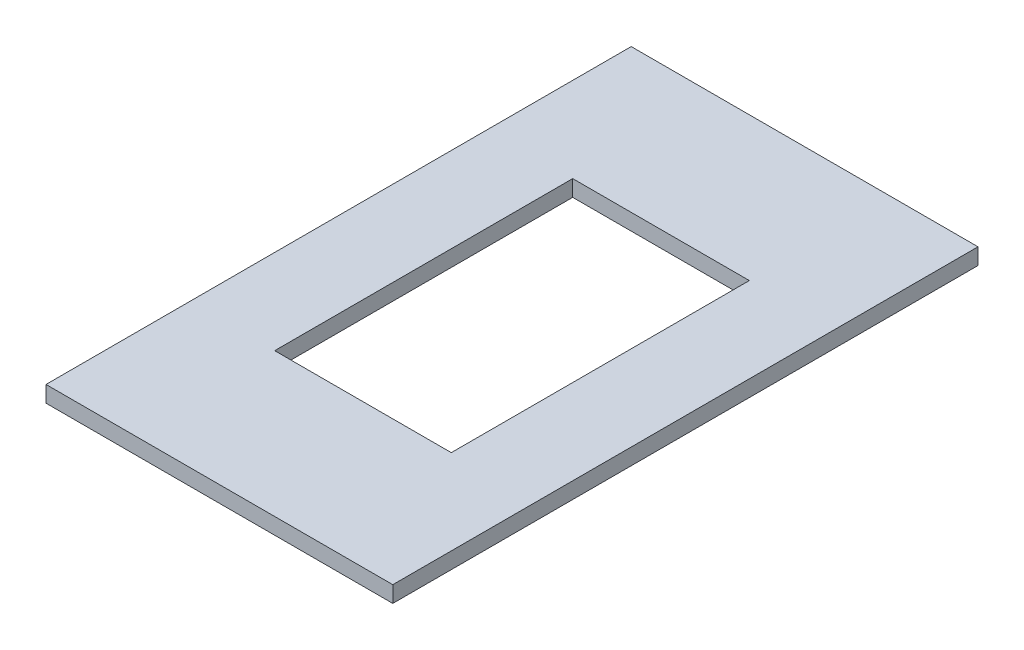
ISO-10303-21;
HEADER;
FILE_DESCRIPTION(('STEP AP214'),'2;1');
FILE_NAME('part.step','',(''),(''),'','','');
FILE_SCHEMA(('AUTOMOTIVE_DESIGN { 1 0 10303 214 1 1 1 1 }'));
ENDSEC;
DATA;
#1=APPLICATION_CONTEXT('core data for automotive mechanical design processes');
#2=APPLICATION_PROTOCOL_DEFINITION('international standard','automotive_design',2000,#1);
#3=PRODUCT_CONTEXT('',#1,'mechanical');
#4=PRODUCT('Part','Part','',(#3));
#5=PRODUCT_RELATED_PRODUCT_CATEGORY('part','',(#4));
#6=PRODUCT_DEFINITION_FORMATION('','',#4);
#7=PRODUCT_DEFINITION_CONTEXT('part definition',#1,'design');
#8=PRODUCT_DEFINITION('design','',#6,#7);
#9=PRODUCT_DEFINITION_SHAPE('','',#8);
#10=(LENGTH_UNIT() NAMED_UNIT(*) SI_UNIT(.MILLI.,.METRE.));
#11=(NAMED_UNIT(*) PLANE_ANGLE_UNIT() SI_UNIT($,.RADIAN.));
#12=(NAMED_UNIT(*) SI_UNIT($,.STERADIAN.) SOLID_ANGLE_UNIT());
#13=UNCERTAINTY_MEASURE_WITH_UNIT(LENGTH_MEASURE(1.E-05),#10,'distance_accuracy_value','');
#14=(GEOMETRIC_REPRESENTATION_CONTEXT(3) GLOBAL_UNCERTAINTY_ASSIGNED_CONTEXT((#13)) GLOBAL_UNIT_ASSIGNED_CONTEXT((#10,
#11,#12)) REPRESENTATION_CONTEXT('',''));
#15=CARTESIAN_POINT('',(0.,0.,0.));
#16=DIRECTION('',(0.,0.,1.));
#17=DIRECTION('',(1.,0.,0.));
#18=AXIS2_PLACEMENT_3D('',#15,#16,#17);
#19=CARTESIAN_POINT('',(213.3333333,10.,0.));
#20=DIRECTION('',(0.,0.,1.));
#21=DIRECTION('',(1.,0.,0.));
#22=AXIS2_PLACEMENT_3D('',#19,#20,#21);
#23=PLANE('',#22);
#24=DIRECTION('',(-1.,0.,0.));
#25=VECTOR('',#24,1.);
#26=CARTESIAN_POINT('',(213.3333333,0.,0.));
#27=LINE('',#26,#25);
#28=CARTESIAN_POINT('',(213.3333333,0.,0.));
#29=VERTEX_POINT('',#28);
#30=CARTESIAN_POINT('',(0.,0.,0.));
#31=VERTEX_POINT('',#30);
#32=EDGE_CURVE('E139',#29,#31,#27,.T.);
#33=ORIENTED_EDGE('',*,*,#32,.T.);
#34=DIRECTION('',(0.,-1.,0.));
#35=VECTOR('',#34,1.);
#36=CARTESIAN_POINT('',(0.,10.,0.));
#37=LINE('',#36,#35);
#38=CARTESIAN_POINT('',(0.,10.,0.));
#39=VERTEX_POINT('',#38);
#40=EDGE_CURVE('E11',#39,#31,#37,.T.);
#41=ORIENTED_EDGE('',*,*,#40,.F.);
#42=DIRECTION('',(-1.,0.,0.));
#43=VECTOR('',#42,1.);
#44=CARTESIAN_POINT('',(213.3333333,10.,0.));
#45=LINE('',#44,#43);
#46=CARTESIAN_POINT('',(213.3333333,10.,0.));
#47=VERTEX_POINT('',#46);
#48=EDGE_CURVE('E143',#47,#39,#45,.T.);
#49=ORIENTED_EDGE('',*,*,#48,.F.);
#50=DIRECTION('',(0.,-1.,0.));
#51=VECTOR('',#50,1.);
#52=CARTESIAN_POINT('',(213.3333333,10.,0.));
#53=LINE('',#52,#51);
#54=EDGE_CURVE('E153',#47,#29,#53,.T.);
#55=ORIENTED_EDGE('',*,*,#54,.T.);
#56=EDGE_LOOP('',(#33,#41,#49,#55));
#57=FACE_BOUND('',#56,.T.);
#58=ADVANCED_FACE('F42',(#57),#23,.F.);
#59=CARTESIAN_POINT('',(0.,10.,0.));
#60=DIRECTION('',(1.,0.,0.));
#61=DIRECTION('',(0.,0.,-1.));
#62=AXIS2_PLACEMENT_3D('',#59,#60,#61);
#63=PLANE('',#62);
#64=DIRECTION('',(0.,0.,1.));
#65=VECTOR('',#64,1.);
#66=CARTESIAN_POINT('',(0.,0.,0.));
#67=LINE('',#66,#65);
#68=CARTESIAN_POINT('',(0.,0.,360.));
#69=VERTEX_POINT('',#68);
#70=EDGE_CURVE('E156',#31,#69,#67,.T.);
#71=ORIENTED_EDGE('',*,*,#70,.T.);
#72=DIRECTION('',(0.,-1.,0.));
#73=VECTOR('',#72,1.);
#74=CARTESIAN_POINT('',(0.,10.,360.));
#75=LINE('',#74,#73);
#76=CARTESIAN_POINT('',(0.,10.,360.));
#77=VERTEX_POINT('',#76);
#78=EDGE_CURVE('E49',#77,#69,#75,.T.);
#79=ORIENTED_EDGE('',*,*,#78,.F.);
#80=DIRECTION('',(0.,0.,1.));
#81=VECTOR('',#80,1.);
#82=CARTESIAN_POINT('',(0.,10.,0.));
#83=LINE('',#82,#81);
#84=EDGE_CURVE('E146',#39,#77,#83,.T.);
#85=ORIENTED_EDGE('',*,*,#84,.F.);
#86=ORIENTED_EDGE('',*,*,#40,.T.);
#87=EDGE_LOOP('',(#71,#79,#85,#86));
#88=FACE_BOUND('',#87,.T.);
#89=ADVANCED_FACE('F184',(#88),#63,.F.);
#90=CARTESIAN_POINT('',(0.,10.,360.));
#91=DIRECTION('',(0.,0.,-1.));
#92=DIRECTION('',(-1.,0.,0.));
#93=AXIS2_PLACEMENT_3D('',#90,#91,#92);
#94=PLANE('',#93);
#95=DIRECTION('',(1.,0.,0.));
#96=VECTOR('',#95,1.);
#97=CARTESIAN_POINT('',(0.,0.,360.));
#98=LINE('',#97,#96);
#99=CARTESIAN_POINT('',(213.3333333,0.,360.));
#100=VERTEX_POINT('',#99);
#101=EDGE_CURVE('E158',#69,#100,#98,.T.);
#102=ORIENTED_EDGE('',*,*,#101,.T.);
#103=DIRECTION('',(0.,-1.,0.));
#104=VECTOR('',#103,1.);
#105=CARTESIAN_POINT('',(213.3333333,10.,360.));
#106=LINE('',#105,#104);
#107=CARTESIAN_POINT('',(213.3333333,10.,360.));
#108=VERTEX_POINT('',#107);
#109=EDGE_CURVE('E163',#108,#100,#106,.T.);
#110=ORIENTED_EDGE('',*,*,#109,.F.);
#111=DIRECTION('',(1.,0.,0.));
#112=VECTOR('',#111,1.);
#113=CARTESIAN_POINT('',(0.,10.,360.));
#114=LINE('',#113,#112);
#115=EDGE_CURVE('E149',#77,#108,#114,.T.);
#116=ORIENTED_EDGE('',*,*,#115,.F.);
#117=ORIENTED_EDGE('',*,*,#78,.T.);
#118=EDGE_LOOP('',(#102,#110,#116,#117));
#119=FACE_BOUND('',#118,.T.);
#120=ADVANCED_FACE('F170',(#119),#94,.F.);
#121=CARTESIAN_POINT('',(213.3333333,10.,360.));
#122=DIRECTION('',(-1.,0.,0.));
#123=DIRECTION('',(0.,0.,1.));
#124=AXIS2_PLACEMENT_3D('',#121,#122,#123);
#125=PLANE('',#124);
#126=DIRECTION('',(0.,0.,-1.));
#127=VECTOR('',#126,1.);
#128=CARTESIAN_POINT('',(213.3333333,0.,360.));
#129=LINE('',#128,#127);
#130=EDGE_CURVE('E147',#100,#29,#129,.T.);
#131=ORIENTED_EDGE('',*,*,#130,.T.);
#132=ORIENTED_EDGE('',*,*,#54,.F.);
#133=DIRECTION('',(0.,0.,-1.));
#134=VECTOR('',#133,1.);
#135=CARTESIAN_POINT('',(213.3333333,10.,360.));
#136=LINE('',#135,#134);
#137=EDGE_CURVE('E151',#108,#47,#136,.T.);
#138=ORIENTED_EDGE('',*,*,#137,.F.);
#139=ORIENTED_EDGE('',*,*,#109,.T.);
#140=EDGE_LOOP('',(#131,#132,#138,#139));
#141=FACE_BOUND('',#140,.T.);
#142=ADVANCED_FACE('F177',(#141),#125,.F.);
#143=CARTESIAN_POINT('',(0.,10.,0.));
#144=DIRECTION('',(0.,1.,0.));
#145=DIRECTION('',(0.,0.,1.));
#146=AXIS2_PLACEMENT_3D('',#143,#144,#145);
#147=PLANE('',#146);
#148=DIRECTION('',(0.,0.,1.));
#149=VECTOR('',#148,1.);
#150=CARTESIAN_POINT('',(52.3440177157457,10.,271.669470090877));
#151=LINE('',#150,#149);
#152=CARTESIAN_POINT('',(52.3440177157457,10.,88.3305299091225));
#153=VERTEX_POINT('',#152);
#154=CARTESIAN_POINT('',(52.3440177157457,10.,271.669470090877));
#155=VERTEX_POINT('',#154);
#156=EDGE_CURVE('E56',#153,#155,#151,.T.);
#157=ORIENTED_EDGE('',*,*,#156,.F.);
#158=DIRECTION('',(-1.,0.,0.));
#159=VECTOR('',#158,1.);
#160=CARTESIAN_POINT('',(160.989315584254,10.,88.3305299091225));
#161=LINE('',#160,#159);
#162=CARTESIAN_POINT('',(160.989315584254,10.,88.3305299091225));
#163=VERTEX_POINT('',#162);
#164=EDGE_CURVE('E124',#163,#153,#161,.T.);
#165=ORIENTED_EDGE('',*,*,#164,.F.);
#166=DIRECTION('',(0.,0.,-1.));
#167=VECTOR('',#166,1.);
#168=CARTESIAN_POINT('',(160.989315584254,10.,271.669470090877));
#169=LINE('',#168,#167);
#170=CARTESIAN_POINT('',(160.989315584254,10.,271.669470090877));
#171=VERTEX_POINT('',#170);
#172=EDGE_CURVE('E127',#171,#163,#169,.T.);
#173=ORIENTED_EDGE('',*,*,#172,.F.);
#174=DIRECTION('',(1.,0.,0.));
#175=VECTOR('',#174,1.);
#176=CARTESIAN_POINT('',(160.989315584254,10.,271.669470090877));
#177=LINE('',#176,#175);
#178=EDGE_CURVE('E133',#155,#171,#177,.T.);
#179=ORIENTED_EDGE('',*,*,#178,.F.);
#180=EDGE_LOOP('',(#157,#165,#173,#179));
#181=FACE_BOUND('',#180,.T.);
#182=ORIENTED_EDGE('',*,*,#48,.T.);
#183=ORIENTED_EDGE('',*,*,#84,.T.);
#184=ORIENTED_EDGE('',*,*,#115,.T.);
#185=ORIENTED_EDGE('',*,*,#137,.T.);
#186=EDGE_LOOP('',(#182,#183,#184,#185));
#187=FACE_BOUND('',#186,.T.);
#188=ADVANCED_FACE('F183',(#181,#187),#147,.T.);
#189=CARTESIAN_POINT('',(0.,0.,0.));
#190=DIRECTION('',(0.,1.,0.));
#191=DIRECTION('',(0.,0.,1.));
#192=AXIS2_PLACEMENT_3D('',#189,#190,#191);
#193=PLANE('',#192);
#194=DIRECTION('',(-1.,0.,0.));
#195=VECTOR('',#194,1.);
#196=CARTESIAN_POINT('',(160.989315584254,0.,88.3305299091225));
#197=LINE('',#196,#195);
#198=CARTESIAN_POINT('',(160.989315584254,0.,88.3305299091225));
#199=VERTEX_POINT('',#198);
#200=CARTESIAN_POINT('',(52.3440177157457,0.,88.3305299091225));
#201=VERTEX_POINT('',#200);
#202=EDGE_CURVE('E114',#199,#201,#197,.T.);
#203=ORIENTED_EDGE('',*,*,#202,.T.);
#204=DIRECTION('',(0.,0.,1.));
#205=VECTOR('',#204,1.);
#206=CARTESIAN_POINT('',(52.3440177157457,0.,271.669470090877));
#207=LINE('',#206,#205);
#208=CARTESIAN_POINT('',(52.3440177157457,0.,271.669470090877));
#209=VERTEX_POINT('',#208);
#210=EDGE_CURVE('E108',#201,#209,#207,.T.);
#211=ORIENTED_EDGE('',*,*,#210,.T.);
#212=DIRECTION('',(1.,0.,0.));
#213=VECTOR('',#212,1.);
#214=CARTESIAN_POINT('',(160.989315584254,0.,271.669470090877));
#215=LINE('',#214,#213);
#216=CARTESIAN_POINT('',(160.989315584254,0.,271.669470090877));
#217=VERTEX_POINT('',#216);
#218=EDGE_CURVE('E117',#209,#217,#215,.T.);
#219=ORIENTED_EDGE('',*,*,#218,.T.);
#220=DIRECTION('',(0.,0.,-1.));
#221=VECTOR('',#220,1.);
#222=CARTESIAN_POINT('',(160.989315584254,0.,271.669470090877));
#223=LINE('',#222,#221);
#224=EDGE_CURVE('E64',#217,#199,#223,.T.);
#225=ORIENTED_EDGE('',*,*,#224,.T.);
#226=EDGE_LOOP('',(#203,#211,#219,#225));
#227=FACE_BOUND('',#226,.T.);
#228=ORIENTED_EDGE('',*,*,#32,.F.);
#229=ORIENTED_EDGE('',*,*,#130,.F.);
#230=ORIENTED_EDGE('',*,*,#101,.F.);
#231=ORIENTED_EDGE('',*,*,#70,.F.);
#232=EDGE_LOOP('',(#228,#229,#230,#231));
#233=FACE_BOUND('',#232,.T.);
#234=ADVANCED_FACE('F121',(#227,#233),#193,.F.);
#235=CARTESIAN_POINT('',(52.3440177157457,0.,271.669470090877));
#236=DIRECTION('',(-1.,0.,0.));
#237=DIRECTION('',(0.,0.,1.));
#238=AXIS2_PLACEMENT_3D('',#235,#236,#237);
#239=PLANE('',#238);
#240=ORIENTED_EDGE('',*,*,#156,.T.);
#241=DIRECTION('',(0.,1.,0.));
#242=VECTOR('',#241,1.);
#243=CARTESIAN_POINT('',(52.3440177157457,0.,271.669470090877));
#244=LINE('',#243,#242);
#245=EDGE_CURVE('E104',#209,#155,#244,.T.);
#246=ORIENTED_EDGE('',*,*,#245,.F.);
#247=ORIENTED_EDGE('',*,*,#210,.F.);
#248=DIRECTION('',(0.,1.,0.));
#249=VECTOR('',#248,1.);
#250=CARTESIAN_POINT('',(52.3440177157457,0.,88.3305299091225));
#251=LINE('',#250,#249);
#252=EDGE_CURVE('E137',#201,#153,#251,.T.);
#253=ORIENTED_EDGE('',*,*,#252,.T.);
#254=EDGE_LOOP('',(#240,#246,#247,#253));
#255=FACE_BOUND('',#254,.T.);
#256=ADVANCED_FACE('F106',(#255),#239,.F.);
#257=CARTESIAN_POINT('',(160.989315584254,0.,88.3305299091225));
#258=DIRECTION('',(0.,0.,-1.));
#259=DIRECTION('',(-1.,0.,0.));
#260=AXIS2_PLACEMENT_3D('',#257,#258,#259);
#261=PLANE('',#260);
#262=ORIENTED_EDGE('',*,*,#164,.T.);
#263=ORIENTED_EDGE('',*,*,#252,.F.);
#264=ORIENTED_EDGE('',*,*,#202,.F.);
#265=DIRECTION('',(0.,1.,0.));
#266=VECTOR('',#265,1.);
#267=CARTESIAN_POINT('',(160.989315584254,0.,88.3305299091225));
#268=LINE('',#267,#266);
#269=EDGE_CURVE('E140',#199,#163,#268,.T.);
#270=ORIENTED_EDGE('',*,*,#269,.T.);
#271=EDGE_LOOP('',(#262,#263,#264,#270));
#272=FACE_BOUND('',#271,.T.);
#273=ADVANCED_FACE('F201',(#272),#261,.F.);
#274=CARTESIAN_POINT('',(160.989315584254,0.,271.669470090877));
#275=DIRECTION('',(1.,0.,0.));
#276=DIRECTION('',(0.,0.,-1.));
#277=AXIS2_PLACEMENT_3D('',#274,#275,#276);
#278=PLANE('',#277);
#279=ORIENTED_EDGE('',*,*,#172,.T.);
#280=ORIENTED_EDGE('',*,*,#269,.F.);
#281=ORIENTED_EDGE('',*,*,#224,.F.);
#282=DIRECTION('',(0.,1.,0.));
#283=VECTOR('',#282,1.);
#284=CARTESIAN_POINT('',(160.989315584254,0.,271.669470090877));
#285=LINE('',#284,#283);
#286=EDGE_CURVE('E113',#217,#171,#285,.T.);
#287=ORIENTED_EDGE('',*,*,#286,.T.);
#288=EDGE_LOOP('',(#279,#280,#281,#287));
#289=FACE_BOUND('',#288,.T.);
#290=ADVANCED_FACE('F204',(#289),#278,.F.);
#291=CARTESIAN_POINT('',(160.989315584254,0.,271.669470090877));
#292=DIRECTION('',(0.,0.,1.));
#293=DIRECTION('',(1.,0.,0.));
#294=AXIS2_PLACEMENT_3D('',#291,#292,#293);
#295=PLANE('',#294);
#296=ORIENTED_EDGE('',*,*,#178,.T.);
#297=ORIENTED_EDGE('',*,*,#286,.F.);
#298=ORIENTED_EDGE('',*,*,#218,.F.);
#299=ORIENTED_EDGE('',*,*,#245,.T.);
#300=EDGE_LOOP('',(#296,#297,#298,#299));
#301=FACE_BOUND('',#300,.T.);
#302=ADVANCED_FACE('F118',(#301),#295,.F.);
#303=CLOSED_SHELL('',(#58,#89,#120,#142,#188,#234,#256,#273,#290,#302));
#304=MANIFOLD_SOLID_BREP('B2',#303);
#305=ADVANCED_BREP_SHAPE_REPRESENTATION('',(#18,#304),#14);
#306=SHAPE_DEFINITION_REPRESENTATION(#9,#305);
ENDSEC;
END-ISO-10303-21;
